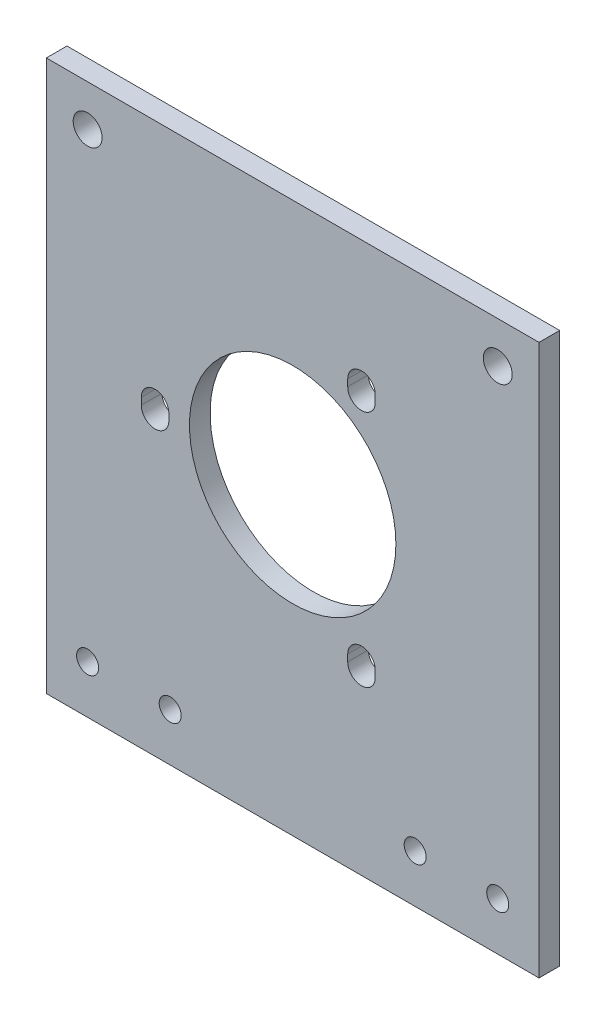
ISO-10303-21;
HEADER;
FILE_DESCRIPTION(('STEP AP214'),'2;1');
FILE_NAME('part.step','',(''),(''),'','','');
FILE_SCHEMA(('AUTOMOTIVE_DESIGN { 1 0 10303 214 1 1 1 1 }'));
ENDSEC;
DATA;
#1=APPLICATION_CONTEXT('core data for automotive mechanical design processes');
#2=APPLICATION_PROTOCOL_DEFINITION('international standard','automotive_design',2000,#1);
#3=PRODUCT_CONTEXT('',#1,'mechanical');
#4=PRODUCT('Part','Part','',(#3));
#5=PRODUCT_RELATED_PRODUCT_CATEGORY('part','',(#4));
#6=PRODUCT_DEFINITION_FORMATION('','',#4);
#7=PRODUCT_DEFINITION_CONTEXT('part definition',#1,'design');
#8=PRODUCT_DEFINITION('design','',#6,#7);
#9=PRODUCT_DEFINITION_SHAPE('','',#8);
#10=(LENGTH_UNIT() NAMED_UNIT(*) SI_UNIT(.MILLI.,.METRE.));
#11=(NAMED_UNIT(*) PLANE_ANGLE_UNIT() SI_UNIT($,.RADIAN.));
#12=(NAMED_UNIT(*) SI_UNIT($,.STERADIAN.) SOLID_ANGLE_UNIT());
#13=UNCERTAINTY_MEASURE_WITH_UNIT(LENGTH_MEASURE(1.E-05),#10,'distance_accuracy_value','');
#14=(GEOMETRIC_REPRESENTATION_CONTEXT(3) GLOBAL_UNCERTAINTY_ASSIGNED_CONTEXT((#13)) GLOBAL_UNIT_ASSIGNED_CONTEXT((#10,
#11,#12)) REPRESENTATION_CONTEXT('',''));
#15=CARTESIAN_POINT('',(0.,0.,0.));
#16=DIRECTION('',(0.,0.,1.));
#17=DIRECTION('',(1.,0.,0.));
#18=AXIS2_PLACEMENT_3D('',#15,#16,#17);
#19=CARTESIAN_POINT('',(0.,0.,3.));
#20=DIRECTION('',(0.,0.,1.));
#21=DIRECTION('',(1.,0.,0.));
#22=AXIS2_PLACEMENT_3D('',#19,#20,#21);
#23=PLANE('',#22);
#24=CARTESIAN_POINT('',(9.99999999999988,17.3205080756658,3.));
#25=DIRECTION('',(0.,0.,1.));
#26=DIRECTION('',(1.,0.,0.));
#27=AXIS2_PLACEMENT_3D('',#24,#25,#26);
#28=CIRCLE('',#27,2.);
#29=CARTESIAN_POINT('',(11.9999999999999,17.3205080756658,3.));
#30=VERTEX_POINT('',#29);
#31=CARTESIAN_POINT('',(7.99999999999988,17.3205080756658,3.));
#32=VERTEX_POINT('',#31);
#33=EDGE_CURVE('E50',#30,#32,#28,.T.);
#34=ORIENTED_EDGE('',*,*,#33,.F.);
#35=DIRECTION('',(0.,1.,0.));
#36=VECTOR('',#35,1.);
#37=CARTESIAN_POINT('',(11.9999999999999,17.3205080756658,3.));
#38=LINE('',#37,#36);
#39=CARTESIAN_POINT('',(11.9999999999999,16.3205080756658,3.));
#40=VERTEX_POINT('',#39);
#41=EDGE_CURVE('E169',#40,#30,#38,.T.);
#42=ORIENTED_EDGE('',*,*,#41,.F.);
#43=CARTESIAN_POINT('',(9.99999999999988,16.3205080756658,3.));
#44=DIRECTION('',(0.,0.,1.));
#45=DIRECTION('',(1.,0.,0.));
#46=AXIS2_PLACEMENT_3D('',#43,#44,#45);
#47=CIRCLE('',#46,2.);
#48=CARTESIAN_POINT('',(7.99999999999988,16.3205080756658,3.));
#49=VERTEX_POINT('',#48);
#50=EDGE_CURVE('E172',#49,#40,#47,.T.);
#51=ORIENTED_EDGE('',*,*,#50,.F.);
#52=DIRECTION('',(0.,-1.,0.));
#53=VECTOR('',#52,1.);
#54=CARTESIAN_POINT('',(7.99999999999988,17.3205080756658,3.));
#55=LINE('',#54,#53);
#56=EDGE_CURVE('E178',#32,#49,#55,.T.);
#57=ORIENTED_EDGE('',*,*,#56,.F.);
#58=EDGE_LOOP('',(#34,#42,#51,#57));
#59=FACE_BOUND('',#58,.T.);
#60=CARTESIAN_POINT('',(-20.,-2.29321769906754E-11,3.));
#61=DIRECTION('',(0.,0.,1.));
#62=DIRECTION('',(1.,0.,0.));
#63=AXIS2_PLACEMENT_3D('',#60,#61,#62);
#64=CIRCLE('',#63,2.);
#65=CARTESIAN_POINT('',(-18.,-2.29323275782644E-11,3.));
#66=VERTEX_POINT('',#65);
#67=CARTESIAN_POINT('',(-22.,-2.29328174402278E-11,3.));
#68=VERTEX_POINT('',#67);
#69=EDGE_CURVE('E58',#66,#68,#64,.T.);
#70=ORIENTED_EDGE('',*,*,#69,.F.);
#71=DIRECTION('',(0.,1.,0.));
#72=VECTOR('',#71,1.);
#73=CARTESIAN_POINT('',(-18.,-2.29323275782644E-11,3.));
#74=LINE('',#73,#72);
#75=CARTESIAN_POINT('',(-18.,-1.00000000002293,3.));
#76=VERTEX_POINT('',#75);
#77=EDGE_CURVE('E193',#76,#66,#74,.T.);
#78=ORIENTED_EDGE('',*,*,#77,.F.);
#79=CARTESIAN_POINT('',(-20.,-1.00000000002293,3.));
#80=DIRECTION('',(0.,0.,1.));
#81=DIRECTION('',(1.,0.,0.));
#82=AXIS2_PLACEMENT_3D('',#79,#80,#81);
#83=CIRCLE('',#82,2.);
#84=CARTESIAN_POINT('',(-22.,-1.00000000002293,3.));
#85=VERTEX_POINT('',#84);
#86=EDGE_CURVE('E208',#85,#76,#83,.T.);
#87=ORIENTED_EDGE('',*,*,#86,.F.);
#88=DIRECTION('',(0.,-1.,0.));
#89=VECTOR('',#88,1.);
#90=CARTESIAN_POINT('',(-22.,-2.29328174369841E-11,3.));
#91=LINE('',#90,#89);
#92=EDGE_CURVE('E204',#68,#85,#91,.T.);
#93=ORIENTED_EDGE('',*,*,#92,.F.);
#94=EDGE_LOOP('',(#70,#78,#87,#93));
#95=FACE_BOUND('',#94,.T.);
#96=CARTESIAN_POINT('',(9.99999999999999,-17.3205080757118,3.));
#97=DIRECTION('',(0.,0.,1.));
#98=DIRECTION('',(1.,0.,0.));
#99=AXIS2_PLACEMENT_3D('',#96,#97,#98);
#100=CIRCLE('',#99,2.0000000000001);
#101=CARTESIAN_POINT('',(12.,-17.3205080757118,3.));
#102=VERTEX_POINT('',#101);
#103=CARTESIAN_POINT('',(7.99999999999979,-17.3205080757118,3.));
#104=VERTEX_POINT('',#103);
#105=EDGE_CURVE('E233',#102,#104,#100,.T.);
#106=ORIENTED_EDGE('',*,*,#105,.F.);
#107=DIRECTION('',(0.,1.,0.));
#108=VECTOR('',#107,1.);
#109=CARTESIAN_POINT('',(12.,-17.3205080757118,3.));
#110=LINE('',#109,#108);
#111=CARTESIAN_POINT('',(12.,-18.3205080757118,3.));
#112=VERTEX_POINT('',#111);
#113=EDGE_CURVE('E223',#112,#102,#110,.T.);
#114=ORIENTED_EDGE('',*,*,#113,.F.);
#115=CARTESIAN_POINT('',(9.99999999999989,-18.3205080757118,3.));
#116=DIRECTION('',(0.,0.,1.));
#117=DIRECTION('',(1.,0.,0.));
#118=AXIS2_PLACEMENT_3D('',#115,#116,#117);
#119=CIRCLE('',#118,2.0000000000001);
#120=CARTESIAN_POINT('',(7.99999999999979,-18.3205080757118,3.));
#121=VERTEX_POINT('',#120);
#122=EDGE_CURVE('E238',#121,#112,#119,.T.);
#123=ORIENTED_EDGE('',*,*,#122,.F.);
#124=DIRECTION('',(0.,-1.,0.));
#125=VECTOR('',#124,1.);
#126=CARTESIAN_POINT('',(7.99999999999979,-17.3205080757118,3.));
#127=LINE('',#126,#125);
#128=EDGE_CURVE('E235',#104,#121,#127,.T.);
#129=ORIENTED_EDGE('',*,*,#128,.F.);
#130=EDGE_LOOP('',(#106,#114,#123,#129));
#131=FACE_BOUND('',#130,.T.);
#132=CARTESIAN_POINT('',(-1.98372071203423E-13,0.,3.));
#133=DIRECTION('',(0.,0.,1.));
#134=DIRECTION('',(1.,0.,0.));
#135=AXIS2_PLACEMENT_3D('',#132,#133,#134);
#136=CIRCLE('',#135,15.);
#137=CARTESIAN_POINT('',(14.9999999999998,0.,3.));
#138=VERTEX_POINT('',#137);
#139=EDGE_CURVE('E185',#138,#138,#136,.T.);
#140=ORIENTED_EDGE('',*,*,#139,.F.);
#141=EDGE_LOOP('',(#140));
#142=FACE_BOUND('',#141,.T.);
#143=CARTESIAN_POINT('',(29.8000000000002,-37.2000000000256,3.));
#144=DIRECTION('',(0.,0.,1.));
#145=DIRECTION('',(1.,0.,0.));
#146=AXIS2_PLACEMENT_3D('',#143,#144,#145);
#147=CIRCLE('',#146,1.60000000000001);
#148=CARTESIAN_POINT('',(31.4000000000002,-37.2000000000256,3.));
#149=VERTEX_POINT('',#148);
#150=EDGE_CURVE('E260',#149,#149,#147,.T.);
#151=ORIENTED_EDGE('',*,*,#150,.F.);
#152=EDGE_LOOP('',(#151));
#153=FACE_BOUND('',#152,.T.);
#154=CARTESIAN_POINT('',(17.8000000000002,-37.2000000000256,3.));
#155=DIRECTION('',(0.,0.,1.));
#156=DIRECTION('',(1.,0.,0.));
#157=AXIS2_PLACEMENT_3D('',#154,#155,#156);
#158=CIRCLE('',#157,1.60000000000001);
#159=CARTESIAN_POINT('',(19.4000000000002,-37.2000000000256,3.));
#160=VERTEX_POINT('',#159);
#161=EDGE_CURVE('E266',#160,#160,#158,.T.);
#162=ORIENTED_EDGE('',*,*,#161,.F.);
#163=EDGE_LOOP('',(#162));
#164=FACE_BOUND('',#163,.T.);
#165=CARTESIAN_POINT('',(-17.7999999999998,-37.2000000000256,3.));
#166=DIRECTION('',(0.,0.,1.));
#167=DIRECTION('',(1.,0.,0.));
#168=AXIS2_PLACEMENT_3D('',#165,#166,#167);
#169=CIRCLE('',#168,1.59999999999997);
#170=CARTESIAN_POINT('',(-16.1999999999998,-37.2000000000256,3.));
#171=VERTEX_POINT('',#170);
#172=EDGE_CURVE('E272',#171,#171,#169,.T.);
#173=ORIENTED_EDGE('',*,*,#172,.F.);
#174=EDGE_LOOP('',(#173));
#175=FACE_BOUND('',#174,.T.);
#176=CARTESIAN_POINT('',(-29.7999999999998,-37.2000000000256,3.));
#177=DIRECTION('',(0.,0.,1.));
#178=DIRECTION('',(1.,0.,0.));
#179=AXIS2_PLACEMENT_3D('',#176,#177,#178);
#180=CIRCLE('',#179,1.59999999999997);
#181=CARTESIAN_POINT('',(-28.1999999999998,-37.2000000000256,3.));
#182=VERTEX_POINT('',#181);
#183=EDGE_CURVE('E253',#182,#182,#180,.T.);
#184=ORIENTED_EDGE('',*,*,#183,.F.);
#185=EDGE_LOOP('',(#184));
#186=FACE_BOUND('',#185,.T.);
#187=DIRECTION('',(0.,-1.,0.));
#188=VECTOR('',#187,1.);
#189=CARTESIAN_POINT('',(-35.8,35.799999999977,3.));
#190=LINE('',#189,#188);
#191=CARTESIAN_POINT('',(-35.8,35.799999999977,3.));
#192=VERTEX_POINT('',#191);
#193=CARTESIAN_POINT('',(-35.8,-44.200000000023,3.));
#194=VERTEX_POINT('',#193);
#195=EDGE_CURVE('E292',#192,#194,#190,.T.);
#196=ORIENTED_EDGE('',*,*,#195,.T.);
#197=DIRECTION('',(1.,0.,0.));
#198=VECTOR('',#197,1.);
#199=CARTESIAN_POINT('',(-35.8,-44.200000000023,3.));
#200=LINE('',#199,#198);
#201=CARTESIAN_POINT('',(35.8,-44.200000000023,3.));
#202=VERTEX_POINT('',#201);
#203=EDGE_CURVE('E295',#194,#202,#200,.T.);
#204=ORIENTED_EDGE('',*,*,#203,.T.);
#205=DIRECTION('',(0.,1.,0.));
#206=VECTOR('',#205,1.);
#207=CARTESIAN_POINT('',(35.8,35.799999999977,3.));
#208=LINE('',#207,#206);
#209=CARTESIAN_POINT('',(35.8,35.799999999977,3.));
#210=VERTEX_POINT('',#209);
#211=EDGE_CURVE('E298',#202,#210,#208,.T.);
#212=ORIENTED_EDGE('',*,*,#211,.T.);
#213=DIRECTION('',(-1.,0.,0.));
#214=VECTOR('',#213,1.);
#215=CARTESIAN_POINT('',(-35.8,35.799999999977,3.));
#216=LINE('',#215,#214);
#217=EDGE_CURVE('E300',#210,#192,#216,.T.);
#218=ORIENTED_EDGE('',*,*,#217,.T.);
#219=EDGE_LOOP('',(#196,#204,#212,#218));
#220=FACE_BOUND('',#219,.T.);
#221=CARTESIAN_POINT('',(-29.8,29.799999999977,3.));
#222=DIRECTION('',(0.,0.,1.));
#223=DIRECTION('',(1.,0.,0.));
#224=AXIS2_PLACEMENT_3D('',#221,#222,#223);
#225=CIRCLE('',#224,2.1);
#226=CARTESIAN_POINT('',(-27.7,29.799999999977,3.));
#227=VERTEX_POINT('',#226);
#228=EDGE_CURVE('E286',#227,#227,#225,.T.);
#229=ORIENTED_EDGE('',*,*,#228,.F.);
#230=EDGE_LOOP('',(#229));
#231=FACE_BOUND('',#230,.T.);
#232=CARTESIAN_POINT('',(29.8,29.799999999977,3.));
#233=DIRECTION('',(0.,0.,1.));
#234=DIRECTION('',(1.,0.,0.));
#235=AXIS2_PLACEMENT_3D('',#232,#233,#234);
#236=CIRCLE('',#235,2.1);
#237=CARTESIAN_POINT('',(31.9,29.799999999977,3.));
#238=VERTEX_POINT('',#237);
#239=EDGE_CURVE('E280',#238,#238,#236,.T.);
#240=ORIENTED_EDGE('',*,*,#239,.F.);
#241=EDGE_LOOP('',(#240));
#242=FACE_BOUND('',#241,.T.);
#243=ADVANCED_FACE('F35',(#59,#95,#131,#142,#153,#164,#175,#186,#220,#231,#242),#23,.T.);
#244=CARTESIAN_POINT('',(0.,0.,0.));
#245=DIRECTION('',(0.,0.,1.));
#246=DIRECTION('',(1.,0.,0.));
#247=AXIS2_PLACEMENT_3D('',#244,#245,#246);
#248=PLANE('',#247);
#249=DIRECTION('',(0.,1.,0.));
#250=VECTOR('',#249,1.);
#251=CARTESIAN_POINT('',(11.9999999999999,17.3205080756658,0.));
#252=LINE('',#251,#250);
#253=CARTESIAN_POINT('',(11.9999999999999,16.3205080756658,0.));
#254=VERTEX_POINT('',#253);
#255=CARTESIAN_POINT('',(11.9999999999999,17.3205080756658,0.));
#256=VERTEX_POINT('',#255);
#257=EDGE_CURVE('E156',#254,#256,#252,.T.);
#258=ORIENTED_EDGE('',*,*,#257,.T.);
#259=CARTESIAN_POINT('',(9.99999999999988,17.3205080756658,0.));
#260=DIRECTION('',(0.,0.,1.));
#261=DIRECTION('',(1.,0.,0.));
#262=AXIS2_PLACEMENT_3D('',#259,#260,#261);
#263=CIRCLE('',#262,2.);
#264=CARTESIAN_POINT('',(7.99999999999988,17.3205080756658,0.));
#265=VERTEX_POINT('',#264);
#266=EDGE_CURVE('E150',#256,#265,#263,.T.);
#267=ORIENTED_EDGE('',*,*,#266,.T.);
#268=DIRECTION('',(0.,-1.,0.));
#269=VECTOR('',#268,1.);
#270=CARTESIAN_POINT('',(7.99999999999988,17.3205080756658,0.));
#271=LINE('',#270,#269);
#272=CARTESIAN_POINT('',(7.99999999999988,16.3205080756658,0.));
#273=VERTEX_POINT('',#272);
#274=EDGE_CURVE('E160',#265,#273,#271,.T.);
#275=ORIENTED_EDGE('',*,*,#274,.T.);
#276=CARTESIAN_POINT('',(9.99999999999988,16.3205080756658,0.));
#277=DIRECTION('',(0.,0.,1.));
#278=DIRECTION('',(1.,0.,0.));
#279=AXIS2_PLACEMENT_3D('',#276,#277,#278);
#280=CIRCLE('',#279,2.);
#281=EDGE_CURVE('E164',#273,#254,#280,.T.);
#282=ORIENTED_EDGE('',*,*,#281,.T.);
#283=EDGE_LOOP('',(#258,#267,#275,#282));
#284=FACE_BOUND('',#283,.T.);
#285=DIRECTION('',(0.,1.,0.));
#286=VECTOR('',#285,1.);
#287=CARTESIAN_POINT('',(-18.,-2.29323275782644E-11,0.));
#288=LINE('',#287,#286);
#289=CARTESIAN_POINT('',(-18.,-1.00000000002293,0.));
#290=VERTEX_POINT('',#289);
#291=CARTESIAN_POINT('',(-18.,-2.29323275782644E-11,0.));
#292=VERTEX_POINT('',#291);
#293=EDGE_CURVE('E199',#290,#292,#288,.T.);
#294=ORIENTED_EDGE('',*,*,#293,.T.);
#295=CARTESIAN_POINT('',(-20.,-2.29321769906754E-11,0.));
#296=DIRECTION('',(0.,0.,1.));
#297=DIRECTION('',(1.,0.,0.));
#298=AXIS2_PLACEMENT_3D('',#295,#296,#297);
#299=CIRCLE('',#298,2.);
#300=CARTESIAN_POINT('',(-22.,-2.29328174369841E-11,0.));
#301=VERTEX_POINT('',#300);
#302=EDGE_CURVE('E189',#292,#301,#299,.T.);
#303=ORIENTED_EDGE('',*,*,#302,.T.);
#304=DIRECTION('',(0.,-1.,0.));
#305=VECTOR('',#304,1.);
#306=CARTESIAN_POINT('',(-22.,-2.29328174369841E-11,0.));
#307=LINE('',#306,#305);
#308=CARTESIAN_POINT('',(-22.,-1.00000000002293,0.));
#309=VERTEX_POINT('',#308);
#310=EDGE_CURVE('E192',#301,#309,#307,.T.);
#311=ORIENTED_EDGE('',*,*,#310,.T.);
#312=CARTESIAN_POINT('',(-20.,-1.00000000002293,0.));
#313=DIRECTION('',(0.,0.,1.));
#314=DIRECTION('',(1.,0.,0.));
#315=AXIS2_PLACEMENT_3D('',#312,#313,#314);
#316=CIRCLE('',#315,2.);
#317=EDGE_CURVE('E196',#309,#290,#316,.T.);
#318=ORIENTED_EDGE('',*,*,#317,.T.);
#319=EDGE_LOOP('',(#294,#303,#311,#318));
#320=FACE_BOUND('',#319,.T.);
#321=DIRECTION('',(0.,1.,0.));
#322=VECTOR('',#321,1.);
#323=CARTESIAN_POINT('',(12.,-17.3205080757118,0.));
#324=LINE('',#323,#322);
#325=CARTESIAN_POINT('',(12.,-18.3205080757118,0.));
#326=VERTEX_POINT('',#325);
#327=CARTESIAN_POINT('',(12.,-17.3205080757118,0.));
#328=VERTEX_POINT('',#327);
#329=EDGE_CURVE('E229',#326,#328,#324,.T.);
#330=ORIENTED_EDGE('',*,*,#329,.T.);
#331=CARTESIAN_POINT('',(9.99999999999999,-17.3205080757118,0.));
#332=DIRECTION('',(0.,0.,1.));
#333=DIRECTION('',(1.,0.,0.));
#334=AXIS2_PLACEMENT_3D('',#331,#332,#333);
#335=CIRCLE('',#334,2.0000000000001);
#336=CARTESIAN_POINT('',(7.99999999999979,-17.3205080757118,0.));
#337=VERTEX_POINT('',#336);
#338=EDGE_CURVE('E219',#328,#337,#335,.T.);
#339=ORIENTED_EDGE('',*,*,#338,.T.);
#340=DIRECTION('',(0.,-1.,0.));
#341=VECTOR('',#340,1.);
#342=CARTESIAN_POINT('',(7.99999999999979,-17.3205080757118,0.));
#343=LINE('',#342,#341);
#344=CARTESIAN_POINT('',(7.99999999999978,-18.3205080757118,0.));
#345=VERTEX_POINT('',#344);
#346=EDGE_CURVE('E222',#337,#345,#343,.T.);
#347=ORIENTED_EDGE('',*,*,#346,.T.);
#348=CARTESIAN_POINT('',(9.99999999999989,-18.3205080757118,0.));
#349=DIRECTION('',(0.,0.,1.));
#350=DIRECTION('',(1.,0.,0.));
#351=AXIS2_PLACEMENT_3D('',#348,#349,#350);
#352=CIRCLE('',#351,2.0000000000001);
#353=EDGE_CURVE('E226',#345,#326,#352,.T.);
#354=ORIENTED_EDGE('',*,*,#353,.T.);
#355=EDGE_LOOP('',(#330,#339,#347,#354));
#356=FACE_BOUND('',#355,.T.);
#357=CARTESIAN_POINT('',(-1.98372071203423E-13,0.,0.));
#358=DIRECTION('',(0.,0.,1.));
#359=DIRECTION('',(1.,0.,0.));
#360=AXIS2_PLACEMENT_3D('',#357,#358,#359);
#361=CIRCLE('',#360,15.);
#362=CARTESIAN_POINT('',(14.9999999999998,0.,0.));
#363=VERTEX_POINT('',#362);
#364=EDGE_CURVE('E250',#363,#363,#361,.T.);
#365=ORIENTED_EDGE('',*,*,#364,.T.);
#366=EDGE_LOOP('',(#365));
#367=FACE_BOUND('',#366,.T.);
#368=CARTESIAN_POINT('',(29.8000000000002,-37.2000000000256,0.));
#369=DIRECTION('',(0.,0.,1.));
#370=DIRECTION('',(1.,0.,0.));
#371=AXIS2_PLACEMENT_3D('',#368,#369,#370);
#372=CIRCLE('',#371,1.60000000000001);
#373=CARTESIAN_POINT('',(31.4000000000002,-37.2000000000256,0.));
#374=VERTEX_POINT('',#373);
#375=EDGE_CURVE('E256',#374,#374,#372,.T.);
#376=ORIENTED_EDGE('',*,*,#375,.T.);
#377=EDGE_LOOP('',(#376));
#378=FACE_BOUND('',#377,.T.);
#379=CARTESIAN_POINT('',(17.8000000000002,-37.2000000000256,0.));
#380=DIRECTION('',(0.,0.,1.));
#381=DIRECTION('',(1.,0.,0.));
#382=AXIS2_PLACEMENT_3D('',#379,#380,#381);
#383=CIRCLE('',#382,1.60000000000001);
#384=CARTESIAN_POINT('',(19.4000000000002,-37.2000000000256,0.));
#385=VERTEX_POINT('',#384);
#386=EDGE_CURVE('E263',#385,#385,#383,.T.);
#387=ORIENTED_EDGE('',*,*,#386,.T.);
#388=EDGE_LOOP('',(#387));
#389=FACE_BOUND('',#388,.T.);
#390=CARTESIAN_POINT('',(-17.7999999999998,-37.2000000000256,0.));
#391=DIRECTION('',(0.,0.,1.));
#392=DIRECTION('',(1.,0.,0.));
#393=AXIS2_PLACEMENT_3D('',#390,#391,#392);
#394=CIRCLE('',#393,1.59999999999997);
#395=CARTESIAN_POINT('',(-16.1999999999998,-37.2000000000256,0.));
#396=VERTEX_POINT('',#395);
#397=EDGE_CURVE('E269',#396,#396,#394,.T.);
#398=ORIENTED_EDGE('',*,*,#397,.T.);
#399=EDGE_LOOP('',(#398));
#400=FACE_BOUND('',#399,.T.);
#401=CARTESIAN_POINT('',(-29.7999999999998,-37.2000000000256,0.));
#402=DIRECTION('',(0.,0.,1.));
#403=DIRECTION('',(1.,0.,0.));
#404=AXIS2_PLACEMENT_3D('',#401,#402,#403);
#405=CIRCLE('',#404,1.59999999999997);
#406=CARTESIAN_POINT('',(-28.1999999999998,-37.2000000000256,0.));
#407=VERTEX_POINT('',#406);
#408=EDGE_CURVE('E275',#407,#407,#405,.T.);
#409=ORIENTED_EDGE('',*,*,#408,.T.);
#410=EDGE_LOOP('',(#409));
#411=FACE_BOUND('',#410,.T.);
#412=DIRECTION('',(0.,-1.,0.));
#413=VECTOR('',#412,1.);
#414=CARTESIAN_POINT('',(-35.8,35.799999999977,0.));
#415=LINE('',#414,#413);
#416=CARTESIAN_POINT('',(-35.8,35.799999999977,0.));
#417=VERTEX_POINT('',#416);
#418=CARTESIAN_POINT('',(-35.8,-44.200000000023,0.));
#419=VERTEX_POINT('',#418);
#420=EDGE_CURVE('E289',#417,#419,#415,.T.);
#421=ORIENTED_EDGE('',*,*,#420,.F.);
#422=DIRECTION('',(-1.,0.,0.));
#423=VECTOR('',#422,1.);
#424=CARTESIAN_POINT('',(-35.8,35.799999999977,0.));
#425=LINE('',#424,#423);
#426=CARTESIAN_POINT('',(35.8,35.799999999977,0.));
#427=VERTEX_POINT('',#426);
#428=EDGE_CURVE('E296',#427,#417,#425,.T.);
#429=ORIENTED_EDGE('',*,*,#428,.F.);
#430=DIRECTION('',(0.,1.,0.));
#431=VECTOR('',#430,1.);
#432=CARTESIAN_POINT('',(35.8,35.799999999977,0.));
#433=LINE('',#432,#431);
#434=CARTESIAN_POINT('',(35.8,-44.200000000023,0.));
#435=VERTEX_POINT('',#434);
#436=EDGE_CURVE('E307',#435,#427,#433,.T.);
#437=ORIENTED_EDGE('',*,*,#436,.F.);
#438=DIRECTION('',(1.,0.,0.));
#439=VECTOR('',#438,1.);
#440=CARTESIAN_POINT('',(-35.8,-44.200000000023,0.));
#441=LINE('',#440,#439);
#442=EDGE_CURVE('E305',#419,#435,#441,.T.);
#443=ORIENTED_EDGE('',*,*,#442,.F.);
#444=EDGE_LOOP('',(#421,#429,#437,#443));
#445=FACE_BOUND('',#444,.T.);
#446=CARTESIAN_POINT('',(-29.8,29.799999999977,0.));
#447=DIRECTION('',(0.,0.,1.));
#448=DIRECTION('',(1.,0.,0.));
#449=AXIS2_PLACEMENT_3D('',#446,#447,#448);
#450=CIRCLE('',#449,2.1);
#451=CARTESIAN_POINT('',(-27.7,29.799999999977,0.));
#452=VERTEX_POINT('',#451);
#453=EDGE_CURVE('E283',#452,#452,#450,.T.);
#454=ORIENTED_EDGE('',*,*,#453,.T.);
#455=EDGE_LOOP('',(#454));
#456=FACE_BOUND('',#455,.T.);
#457=CARTESIAN_POINT('',(29.8,29.799999999977,0.));
#458=DIRECTION('',(0.,0.,1.));
#459=DIRECTION('',(1.,0.,0.));
#460=AXIS2_PLACEMENT_3D('',#457,#458,#459);
#461=CIRCLE('',#460,2.1);
#462=CARTESIAN_POINT('',(31.9,29.799999999977,0.));
#463=VERTEX_POINT('',#462);
#464=EDGE_CURVE('E259',#463,#463,#461,.T.);
#465=ORIENTED_EDGE('',*,*,#464,.T.);
#466=EDGE_LOOP('',(#465));
#467=FACE_BOUND('',#466,.T.);
#468=ADVANCED_FACE('F166',(#284,#320,#356,#367,#378,#389,#400,#411,#445,#456,#467),#248,.F.);
#469=CARTESIAN_POINT('',(-35.8,35.799999999977,3.));
#470=DIRECTION('',(1.,0.,0.));
#471=DIRECTION('',(0.,1.,0.));
#472=AXIS2_PLACEMENT_3D('',#469,#470,#471);
#473=PLANE('',#472);
#474=ORIENTED_EDGE('',*,*,#420,.T.);
#475=DIRECTION('',(0.,0.,-1.));
#476=VECTOR('',#475,1.);
#477=CARTESIAN_POINT('',(-35.8,-44.200000000023,3.));
#478=LINE('',#477,#476);
#479=EDGE_CURVE('E11',#194,#419,#478,.T.);
#480=ORIENTED_EDGE('',*,*,#479,.F.);
#481=ORIENTED_EDGE('',*,*,#195,.F.);
#482=DIRECTION('',(0.,0.,-1.));
#483=VECTOR('',#482,1.);
#484=CARTESIAN_POINT('',(-35.8,35.799999999977,3.));
#485=LINE('',#484,#483);
#486=EDGE_CURVE('E302',#192,#417,#485,.T.);
#487=ORIENTED_EDGE('',*,*,#486,.T.);
#488=EDGE_LOOP('',(#474,#480,#481,#487));
#489=FACE_BOUND('',#488,.T.);
#490=ADVANCED_FACE('F37',(#489),#473,.F.);
#491=CARTESIAN_POINT('',(-35.8,-44.200000000023,3.));
#492=DIRECTION('',(0.,1.,0.));
#493=DIRECTION('',(0.,0.,1.));
#494=AXIS2_PLACEMENT_3D('',#491,#492,#493);
#495=PLANE('',#494);
#496=ORIENTED_EDGE('',*,*,#442,.T.);
#497=DIRECTION('',(0.,0.,-1.));
#498=VECTOR('',#497,1.);
#499=CARTESIAN_POINT('',(35.8,-44.200000000023,3.));
#500=LINE('',#499,#498);
#501=EDGE_CURVE('E43',#202,#435,#500,.T.);
#502=ORIENTED_EDGE('',*,*,#501,.F.);
#503=ORIENTED_EDGE('',*,*,#203,.F.);
#504=ORIENTED_EDGE('',*,*,#479,.T.);
#505=EDGE_LOOP('',(#496,#502,#503,#504));
#506=FACE_BOUND('',#505,.T.);
#507=ADVANCED_FACE('F335',(#506),#495,.F.);
#508=CARTESIAN_POINT('',(35.8,35.799999999977,3.));
#509=DIRECTION('',(-1.,0.,0.));
#510=DIRECTION('',(0.,-1.,0.));
#511=AXIS2_PLACEMENT_3D('',#508,#509,#510);
#512=PLANE('',#511);
#513=ORIENTED_EDGE('',*,*,#436,.T.);
#514=DIRECTION('',(0.,0.,-1.));
#515=VECTOR('',#514,1.);
#516=CARTESIAN_POINT('',(35.8,35.799999999977,3.));
#517=LINE('',#516,#515);
#518=EDGE_CURVE('E312',#210,#427,#517,.T.);
#519=ORIENTED_EDGE('',*,*,#518,.F.);
#520=ORIENTED_EDGE('',*,*,#211,.F.);
#521=ORIENTED_EDGE('',*,*,#501,.T.);
#522=EDGE_LOOP('',(#513,#519,#520,#521));
#523=FACE_BOUND('',#522,.T.);
#524=ADVANCED_FACE('F319',(#523),#512,.F.);
#525=CARTESIAN_POINT('',(-35.8,35.799999999977,3.));
#526=DIRECTION('',(0.,-1.,0.));
#527=DIRECTION('',(0.,0.,-1.));
#528=AXIS2_PLACEMENT_3D('',#525,#526,#527);
#529=PLANE('',#528);
#530=ORIENTED_EDGE('',*,*,#428,.T.);
#531=ORIENTED_EDGE('',*,*,#486,.F.);
#532=ORIENTED_EDGE('',*,*,#217,.F.);
#533=ORIENTED_EDGE('',*,*,#518,.T.);
#534=EDGE_LOOP('',(#530,#531,#532,#533));
#535=FACE_BOUND('',#534,.T.);
#536=ADVANCED_FACE('F328',(#535),#529,.F.);
#537=CARTESIAN_POINT('',(-29.8,29.799999999977,3.));
#538=DIRECTION('',(0.,0.,-1.));
#539=DIRECTION('',(-1.,0.,0.));
#540=AXIS2_PLACEMENT_3D('',#537,#538,#539);
#541=CYLINDRICAL_SURFACE('',#540,2.1);
#542=ORIENTED_EDGE('',*,*,#228,.T.);
#543=EDGE_LOOP('',(#542));
#544=FACE_BOUND('',#543,.T.);
#545=ORIENTED_EDGE('',*,*,#453,.F.);
#546=EDGE_LOOP('',(#545));
#547=FACE_BOUND('',#546,.T.);
#548=ADVANCED_FACE('F352',(#544,#547),#541,.F.);
#549=CARTESIAN_POINT('',(29.8,29.799999999977,3.));
#550=DIRECTION('',(0.,0.,-1.));
#551=DIRECTION('',(-1.,0.,0.));
#552=AXIS2_PLACEMENT_3D('',#549,#550,#551);
#553=CYLINDRICAL_SURFACE('',#552,2.1);
#554=ORIENTED_EDGE('',*,*,#239,.T.);
#555=EDGE_LOOP('',(#554));
#556=FACE_BOUND('',#555,.T.);
#557=ORIENTED_EDGE('',*,*,#464,.F.);
#558=EDGE_LOOP('',(#557));
#559=FACE_BOUND('',#558,.T.);
#560=ADVANCED_FACE('F359',(#556,#559),#553,.F.);
#561=CARTESIAN_POINT('',(-29.7999999999998,-37.2000000000256,0.));
#562=DIRECTION('',(0.,0.,1.));
#563=DIRECTION('',(1.,0.,0.));
#564=AXIS2_PLACEMENT_3D('',#561,#562,#563);
#565=CYLINDRICAL_SURFACE('',#564,1.59999999999997);
#566=ORIENTED_EDGE('',*,*,#408,.F.);
#567=EDGE_LOOP('',(#566));
#568=FACE_BOUND('',#567,.T.);
#569=ORIENTED_EDGE('',*,*,#183,.T.);
#570=EDGE_LOOP('',(#569));
#571=FACE_BOUND('',#570,.T.);
#572=ADVANCED_FACE('F364',(#568,#571),#565,.F.);
#573=CARTESIAN_POINT('',(-17.7999999999998,-37.2000000000256,0.));
#574=DIRECTION('',(0.,0.,1.));
#575=DIRECTION('',(1.,0.,0.));
#576=AXIS2_PLACEMENT_3D('',#573,#574,#575);
#577=CYLINDRICAL_SURFACE('',#576,1.59999999999997);
#578=ORIENTED_EDGE('',*,*,#397,.F.);
#579=EDGE_LOOP('',(#578));
#580=FACE_BOUND('',#579,.T.);
#581=ORIENTED_EDGE('',*,*,#172,.T.);
#582=EDGE_LOOP('',(#581));
#583=FACE_BOUND('',#582,.T.);
#584=ADVANCED_FACE('F377',(#580,#583),#577,.F.);
#585=CARTESIAN_POINT('',(17.8000000000002,-37.2000000000256,0.));
#586=DIRECTION('',(0.,0.,1.));
#587=DIRECTION('',(1.,0.,0.));
#588=AXIS2_PLACEMENT_3D('',#585,#586,#587);
#589=CYLINDRICAL_SURFACE('',#588,1.60000000000001);
#590=ORIENTED_EDGE('',*,*,#386,.F.);
#591=EDGE_LOOP('',(#590));
#592=FACE_BOUND('',#591,.T.);
#593=ORIENTED_EDGE('',*,*,#161,.T.);
#594=EDGE_LOOP('',(#593));
#595=FACE_BOUND('',#594,.T.);
#596=ADVANCED_FACE('F383',(#592,#595),#589,.F.);
#597=CARTESIAN_POINT('',(29.8000000000002,-37.2000000000256,0.));
#598=DIRECTION('',(0.,0.,1.));
#599=DIRECTION('',(1.,0.,0.));
#600=AXIS2_PLACEMENT_3D('',#597,#598,#599);
#601=CYLINDRICAL_SURFACE('',#600,1.60000000000001);
#602=ORIENTED_EDGE('',*,*,#375,.F.);
#603=EDGE_LOOP('',(#602));
#604=FACE_BOUND('',#603,.T.);
#605=ORIENTED_EDGE('',*,*,#150,.T.);
#606=EDGE_LOOP('',(#605));
#607=FACE_BOUND('',#606,.T.);
#608=ADVANCED_FACE('F387',(#604,#607),#601,.F.);
#609=CARTESIAN_POINT('',(-1.98372071203423E-13,0.,0.));
#610=DIRECTION('',(0.,0.,1.));
#611=DIRECTION('',(1.,0.,0.));
#612=AXIS2_PLACEMENT_3D('',#609,#610,#611);
#613=CYLINDRICAL_SURFACE('',#612,15.);
#614=ORIENTED_EDGE('',*,*,#364,.F.);
#615=EDGE_LOOP('',(#614));
#616=FACE_BOUND('',#615,.T.);
#617=ORIENTED_EDGE('',*,*,#139,.T.);
#618=EDGE_LOOP('',(#617));
#619=FACE_BOUND('',#618,.T.);
#620=ADVANCED_FACE('F391',(#616,#619),#613,.F.);
#621=CARTESIAN_POINT('',(9.99999999999999,-17.3205080757118,0.));
#622=DIRECTION('',(0.,0.,1.));
#623=DIRECTION('',(1.,0.,0.));
#624=AXIS2_PLACEMENT_3D('',#621,#622,#623);
#625=CYLINDRICAL_SURFACE('',#624,2.0000000000001);
#626=ORIENTED_EDGE('',*,*,#105,.T.);
#627=DIRECTION('',(0.,0.,1.));
#628=VECTOR('',#627,1.);
#629=CARTESIAN_POINT('',(7.99999999999979,-17.3205080757118,0.));
#630=LINE('',#629,#628);
#631=EDGE_CURVE('E232',#337,#104,#630,.T.);
#632=ORIENTED_EDGE('',*,*,#631,.F.);
#633=ORIENTED_EDGE('',*,*,#338,.F.);
#634=DIRECTION('',(0.,0.,1.));
#635=VECTOR('',#634,1.);
#636=CARTESIAN_POINT('',(12.,-17.3205080757118,0.));
#637=LINE('',#636,#635);
#638=EDGE_CURVE('E205',#328,#102,#637,.T.);
#639=ORIENTED_EDGE('',*,*,#638,.T.);
#640=EDGE_LOOP('',(#626,#632,#633,#639));
#641=FACE_BOUND('',#640,.T.);
#642=ADVANCED_FACE('F395',(#641),#625,.F.);
#643=CARTESIAN_POINT('',(12.,-17.3205080757118,0.));
#644=DIRECTION('',(1.,0.,0.));
#645=DIRECTION('',(0.,1.,0.));
#646=AXIS2_PLACEMENT_3D('',#643,#644,#645);
#647=PLANE('',#646);
#648=ORIENTED_EDGE('',*,*,#113,.T.);
#649=ORIENTED_EDGE('',*,*,#638,.F.);
#650=ORIENTED_EDGE('',*,*,#329,.F.);
#651=DIRECTION('',(0.,0.,1.));
#652=VECTOR('',#651,1.);
#653=CARTESIAN_POINT('',(12.,-18.3205080757118,0.));
#654=LINE('',#653,#652);
#655=EDGE_CURVE('E244',#326,#112,#654,.T.);
#656=ORIENTED_EDGE('',*,*,#655,.T.);
#657=EDGE_LOOP('',(#648,#649,#650,#656));
#658=FACE_BOUND('',#657,.T.);
#659=ADVANCED_FACE('F399',(#658),#647,.F.);
#660=CARTESIAN_POINT('',(9.99999999999989,-18.3205080757118,0.));
#661=DIRECTION('',(0.,0.,1.));
#662=DIRECTION('',(1.,0.,0.));
#663=AXIS2_PLACEMENT_3D('',#660,#661,#662);
#664=CYLINDRICAL_SURFACE('',#663,2.0000000000001);
#665=ORIENTED_EDGE('',*,*,#122,.T.);
#666=ORIENTED_EDGE('',*,*,#655,.F.);
#667=ORIENTED_EDGE('',*,*,#353,.F.);
#668=DIRECTION('',(0.,0.,1.));
#669=VECTOR('',#668,1.);
#670=CARTESIAN_POINT('',(7.99999999999979,-18.3205080757118,0.));
#671=LINE('',#670,#669);
#672=EDGE_CURVE('E246',#345,#121,#671,.T.);
#673=ORIENTED_EDGE('',*,*,#672,.T.);
#674=EDGE_LOOP('',(#665,#666,#667,#673));
#675=FACE_BOUND('',#674,.T.);
#676=ADVANCED_FACE('F405',(#675),#664,.F.);
#677=CARTESIAN_POINT('',(7.99999999999979,-17.3205080757118,0.));
#678=DIRECTION('',(-1.,0.,0.));
#679=DIRECTION('',(0.,-1.,0.));
#680=AXIS2_PLACEMENT_3D('',#677,#678,#679);
#681=PLANE('',#680);
#682=ORIENTED_EDGE('',*,*,#128,.T.);
#683=ORIENTED_EDGE('',*,*,#672,.F.);
#684=ORIENTED_EDGE('',*,*,#346,.F.);
#685=ORIENTED_EDGE('',*,*,#631,.T.);
#686=EDGE_LOOP('',(#682,#683,#684,#685));
#687=FACE_BOUND('',#686,.T.);
#688=ADVANCED_FACE('F401',(#687),#681,.F.);
#689=CARTESIAN_POINT('',(-20.,-2.29321769906754E-11,0.));
#690=DIRECTION('',(0.,0.,1.));
#691=DIRECTION('',(1.,0.,0.));
#692=AXIS2_PLACEMENT_3D('',#689,#690,#691);
#693=CYLINDRICAL_SURFACE('',#692,2.);
#694=ORIENTED_EDGE('',*,*,#69,.T.);
#695=DIRECTION('',(0.,0.,1.));
#696=VECTOR('',#695,1.);
#697=CARTESIAN_POINT('',(-22.,-2.29328174369841E-11,0.));
#698=LINE('',#697,#696);
#699=EDGE_CURVE('E202',#301,#68,#698,.T.);
#700=ORIENTED_EDGE('',*,*,#699,.F.);
#701=ORIENTED_EDGE('',*,*,#302,.F.);
#702=DIRECTION('',(0.,0.,1.));
#703=VECTOR('',#702,1.);
#704=CARTESIAN_POINT('',(-18.,-2.29323275782644E-11,0.));
#705=LINE('',#704,#703);
#706=EDGE_CURVE('E179',#292,#66,#705,.T.);
#707=ORIENTED_EDGE('',*,*,#706,.T.);
#708=EDGE_LOOP('',(#694,#700,#701,#707));
#709=FACE_BOUND('',#708,.T.);
#710=ADVANCED_FACE('F404',(#709),#693,.F.);
#711=CARTESIAN_POINT('',(-18.,-2.29323275782644E-11,0.));
#712=DIRECTION('',(1.,0.,0.));
#713=DIRECTION('',(0.,0.,-1.));
#714=AXIS2_PLACEMENT_3D('',#711,#712,#713);
#715=PLANE('',#714);
#716=ORIENTED_EDGE('',*,*,#77,.T.);
#717=ORIENTED_EDGE('',*,*,#706,.F.);
#718=ORIENTED_EDGE('',*,*,#293,.F.);
#719=DIRECTION('',(0.,0.,1.));
#720=VECTOR('',#719,1.);
#721=CARTESIAN_POINT('',(-18.,-1.00000000002293,0.));
#722=LINE('',#721,#720);
#723=EDGE_CURVE('E214',#290,#76,#722,.T.);
#724=ORIENTED_EDGE('',*,*,#723,.T.);
#725=EDGE_LOOP('',(#716,#717,#718,#724));
#726=FACE_BOUND('',#725,.T.);
#727=ADVANCED_FACE('F415',(#726),#715,.F.);
#728=CARTESIAN_POINT('',(-20.,-1.00000000002293,0.));
#729=DIRECTION('',(0.,0.,1.));
#730=DIRECTION('',(1.,0.,0.));
#731=AXIS2_PLACEMENT_3D('',#728,#729,#730);
#732=CYLINDRICAL_SURFACE('',#731,2.);
#733=ORIENTED_EDGE('',*,*,#86,.T.);
#734=ORIENTED_EDGE('',*,*,#723,.F.);
#735=ORIENTED_EDGE('',*,*,#317,.F.);
#736=DIRECTION('',(0.,0.,1.));
#737=VECTOR('',#736,1.);
#738=CARTESIAN_POINT('',(-22.,-1.00000000002293,0.));
#739=LINE('',#738,#737);
#740=EDGE_CURVE('E216',#309,#85,#739,.T.);
#741=ORIENTED_EDGE('',*,*,#740,.T.);
#742=EDGE_LOOP('',(#733,#734,#735,#741));
#743=FACE_BOUND('',#742,.T.);
#744=ADVANCED_FACE('F419',(#743),#732,.F.);
#745=CARTESIAN_POINT('',(-22.,-2.29328174369841E-11,0.));
#746=DIRECTION('',(-1.,0.,0.));
#747=DIRECTION('',(0.,0.,1.));
#748=AXIS2_PLACEMENT_3D('',#745,#746,#747);
#749=PLANE('',#748);
#750=ORIENTED_EDGE('',*,*,#92,.T.);
#751=ORIENTED_EDGE('',*,*,#740,.F.);
#752=ORIENTED_EDGE('',*,*,#310,.F.);
#753=ORIENTED_EDGE('',*,*,#699,.T.);
#754=EDGE_LOOP('',(#750,#751,#752,#753));
#755=FACE_BOUND('',#754,.T.);
#756=ADVANCED_FACE('F416',(#755),#749,.F.);
#757=CARTESIAN_POINT('',(9.99999999999988,17.3205080756658,0.));
#758=DIRECTION('',(0.,0.,1.));
#759=DIRECTION('',(1.,0.,0.));
#760=AXIS2_PLACEMENT_3D('',#757,#758,#759);
#761=CYLINDRICAL_SURFACE('',#760,2.);
#762=ORIENTED_EDGE('',*,*,#33,.T.);
#763=DIRECTION('',(0.,0.,1.));
#764=VECTOR('',#763,1.);
#765=CARTESIAN_POINT('',(7.99999999999988,17.3205080756658,0.));
#766=LINE('',#765,#764);
#767=EDGE_CURVE('E146',#265,#32,#766,.T.);
#768=ORIENTED_EDGE('',*,*,#767,.F.);
#769=ORIENTED_EDGE('',*,*,#266,.F.);
#770=DIRECTION('',(0.,0.,1.));
#771=VECTOR('',#770,1.);
#772=CARTESIAN_POINT('',(11.9999999999999,17.3205080756658,0.));
#773=LINE('',#772,#771);
#774=EDGE_CURVE('E183',#256,#30,#773,.T.);
#775=ORIENTED_EDGE('',*,*,#774,.T.);
#776=EDGE_LOOP('',(#762,#768,#769,#775));
#777=FACE_BOUND('',#776,.T.);
#778=ADVANCED_FACE('F148',(#777),#761,.F.);
#779=CARTESIAN_POINT('',(11.9999999999999,17.3205080756658,0.));
#780=DIRECTION('',(1.,0.,0.));
#781=DIRECTION('',(0.,0.,-1.));
#782=AXIS2_PLACEMENT_3D('',#779,#780,#781);
#783=PLANE('',#782);
#784=ORIENTED_EDGE('',*,*,#41,.T.);
#785=ORIENTED_EDGE('',*,*,#774,.F.);
#786=ORIENTED_EDGE('',*,*,#257,.F.);
#787=DIRECTION('',(0.,0.,1.));
#788=VECTOR('',#787,1.);
#789=CARTESIAN_POINT('',(11.9999999999999,16.3205080756658,0.));
#790=LINE('',#789,#788);
#791=EDGE_CURVE('E186',#254,#40,#790,.T.);
#792=ORIENTED_EDGE('',*,*,#791,.T.);
#793=EDGE_LOOP('',(#784,#785,#786,#792));
#794=FACE_BOUND('',#793,.T.);
#795=ADVANCED_FACE('F429',(#794),#783,.F.);
#796=CARTESIAN_POINT('',(9.99999999999988,16.3205080756658,0.));
#797=DIRECTION('',(0.,0.,1.));
#798=DIRECTION('',(1.,0.,0.));
#799=AXIS2_PLACEMENT_3D('',#796,#797,#798);
#800=CYLINDRICAL_SURFACE('',#799,2.);
#801=ORIENTED_EDGE('',*,*,#50,.T.);
#802=ORIENTED_EDGE('',*,*,#791,.F.);
#803=ORIENTED_EDGE('',*,*,#281,.F.);
#804=DIRECTION('',(0.,0.,1.));
#805=VECTOR('',#804,1.);
#806=CARTESIAN_POINT('',(7.99999999999988,16.3205080756658,0.));
#807=LINE('',#806,#805);
#808=EDGE_CURVE('E155',#273,#49,#807,.T.);
#809=ORIENTED_EDGE('',*,*,#808,.T.);
#810=EDGE_LOOP('',(#801,#802,#803,#809));
#811=FACE_BOUND('',#810,.T.);
#812=ADVANCED_FACE('F432',(#811),#800,.F.);
#813=CARTESIAN_POINT('',(7.99999999999988,17.3205080756658,0.));
#814=DIRECTION('',(-1.,0.,0.));
#815=DIRECTION('',(0.,0.,1.));
#816=AXIS2_PLACEMENT_3D('',#813,#814,#815);
#817=PLANE('',#816);
#818=ORIENTED_EDGE('',*,*,#56,.T.);
#819=ORIENTED_EDGE('',*,*,#808,.F.);
#820=ORIENTED_EDGE('',*,*,#274,.F.);
#821=ORIENTED_EDGE('',*,*,#767,.T.);
#822=EDGE_LOOP('',(#818,#819,#820,#821));
#823=FACE_BOUND('',#822,.T.);
#824=ADVANCED_FACE('F161',(#823),#817,.F.);
#825=CLOSED_SHELL('',(#243,#468,#490,#507,#524,#536,#548,#560,#572,#584,#596,#608,#620,#642,
#659,#676,#688,#710,#727,#744,#756,#778,#795,#812,#824));
#826=MANIFOLD_SOLID_BREP('B2',#825);
#827=ADVANCED_BREP_SHAPE_REPRESENTATION('',(#18,#826),#14);
#828=SHAPE_DEFINITION_REPRESENTATION(#9,#827);
ENDSEC;
END-ISO-10303-21;
